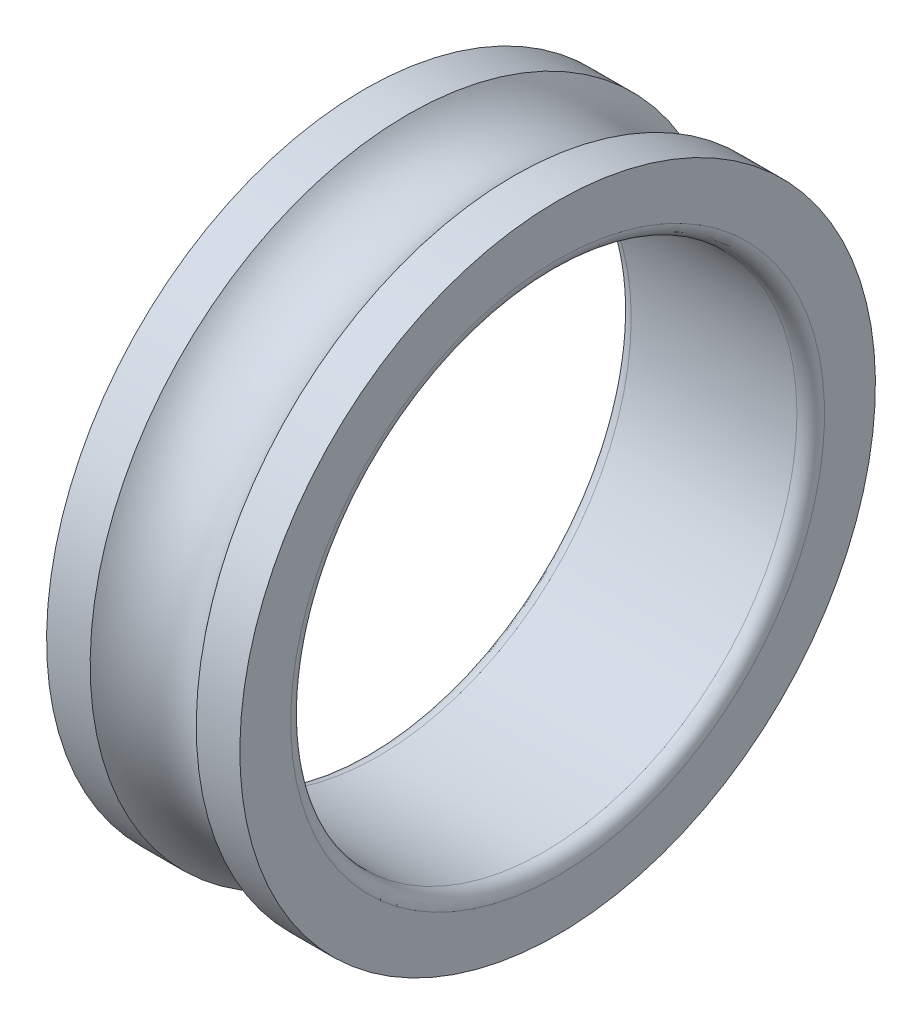
ISO-10303-21;
HEADER;
FILE_DESCRIPTION(('STEP AP214'),'2;1');
FILE_NAME('part.step','',(''),(''),'','','');
FILE_SCHEMA(('AUTOMOTIVE_DESIGN { 1 0 10303 214 1 1 1 1 }'));
ENDSEC;
DATA;
#1=APPLICATION_CONTEXT('core data for automotive mechanical design processes');
#2=APPLICATION_PROTOCOL_DEFINITION('international standard','automotive_design',2000,#1);
#3=PRODUCT_CONTEXT('',#1,'mechanical');
#4=PRODUCT('Part','Part','',(#3));
#5=PRODUCT_RELATED_PRODUCT_CATEGORY('part','',(#4));
#6=PRODUCT_DEFINITION_FORMATION('','',#4);
#7=PRODUCT_DEFINITION_CONTEXT('part definition',#1,'design');
#8=PRODUCT_DEFINITION('design','',#6,#7);
#9=PRODUCT_DEFINITION_SHAPE('','',#8);
#10=(LENGTH_UNIT() NAMED_UNIT(*) SI_UNIT(.MILLI.,.METRE.));
#11=(NAMED_UNIT(*) PLANE_ANGLE_UNIT() SI_UNIT($,.RADIAN.));
#12=(NAMED_UNIT(*) SI_UNIT($,.STERADIAN.) SOLID_ANGLE_UNIT());
#13=UNCERTAINTY_MEASURE_WITH_UNIT(LENGTH_MEASURE(1.E-05),#10,'distance_accuracy_value','');
#14=(GEOMETRIC_REPRESENTATION_CONTEXT(3) GLOBAL_UNCERTAINTY_ASSIGNED_CONTEXT((#13)) GLOBAL_UNIT_ASSIGNED_CONTEXT((#10,
#11,#12)) REPRESENTATION_CONTEXT('',''));
#15=CARTESIAN_POINT('',(0.,0.,0.));
#16=DIRECTION('',(0.,0.,1.));
#17=DIRECTION('',(1.,0.,0.));
#18=AXIS2_PLACEMENT_3D('',#15,#16,#17);
#19=CARTESIAN_POINT('',(18.6322012421065,0.,0.));
#20=DIRECTION('',(-1.,0.,0.));
#21=DIRECTION('',(0.,1.,0.));
#22=AXIS2_PLACEMENT_3D('',#19,#20,#21);
#23=CYLINDRICAL_SURFACE('',#22,34.53);
#24=CARTESIAN_POINT('',(16.2644024842129,0.,0.));
#25=DIRECTION('',(1.,0.,0.));
#26=DIRECTION('',(0.,1.,0.));
#27=AXIS2_PLACEMENT_3D('',#24,#25,#26);
#28=CIRCLE('',#27,34.53);
#29=CARTESIAN_POINT('',(16.2644024842129,34.53,0.));
#30=VERTEX_POINT('',#29);
#31=EDGE_CURVE('E11',#30,#30,#28,.T.);
#32=ORIENTED_EDGE('',*,*,#31,.T.);
#33=EDGE_LOOP('',(#32));
#34=FACE_BOUND('',#33,.T.);
#35=CARTESIAN_POINT('',(21.,0.,0.));
#36=DIRECTION('',(1.,0.,0.));
#37=DIRECTION('',(0.,1.,0.));
#38=AXIS2_PLACEMENT_3D('',#35,#36,#37);
#39=CIRCLE('',#38,34.53);
#40=CARTESIAN_POINT('',(21.,34.53,0.));
#41=VERTEX_POINT('',#40);
#42=EDGE_CURVE('E20',#41,#41,#39,.T.);
#43=ORIENTED_EDGE('',*,*,#42,.F.);
#44=EDGE_LOOP('',(#43));
#45=FACE_BOUND('',#44,.T.);
#46=ADVANCED_FACE('F16',(#34,#45),#23,.T.);
#47=CARTESIAN_POINT('',(10.5,0.,0.));
#48=DIRECTION('',(1.,0.,0.));
#49=DIRECTION('',(0.,0.,-1.));
#50=AXIS2_PLACEMENT_3D('',#47,#48,#49);
#51=TOROIDAL_SURFACE('',#50,38.75,7.144);
#52=CARTESIAN_POINT('',(4.73559751578708,0.,0.));
#53=DIRECTION('',(1.,0.,0.));
#54=DIRECTION('',(0.,1.,0.));
#55=AXIS2_PLACEMENT_3D('',#52,#53,#54);
#56=CIRCLE('',#55,34.53);
#57=CARTESIAN_POINT('',(4.73559751578708,34.53,0.));
#58=VERTEX_POINT('',#57);
#59=EDGE_CURVE('E26',#58,#58,#56,.T.);
#60=ORIENTED_EDGE('',*,*,#59,.T.);
#61=EDGE_LOOP('',(#60));
#62=FACE_BOUND('',#61,.T.);
#63=ORIENTED_EDGE('',*,*,#31,.F.);
#64=EDGE_LOOP('',(#63));
#65=FACE_BOUND('',#64,.T.);
#66=ADVANCED_FACE('F66',(#62,#65),#51,.F.);
#67=CARTESIAN_POINT('',(2.36779875789354,0.,0.));
#68=DIRECTION('',(-1.,0.,0.));
#69=DIRECTION('',(0.,1.,0.));
#70=AXIS2_PLACEMENT_3D('',#67,#68,#69);
#71=CYLINDRICAL_SURFACE('',#70,34.53);
#72=CARTESIAN_POINT('',(0.,0.,0.));
#73=DIRECTION('',(1.,0.,0.));
#74=DIRECTION('',(0.,1.,0.));
#75=AXIS2_PLACEMENT_3D('',#72,#73,#74);
#76=CIRCLE('',#75,34.53);
#77=CARTESIAN_POINT('',(0.,34.53,0.));
#78=VERTEX_POINT('',#77);
#79=EDGE_CURVE('E57',#78,#78,#76,.T.);
#80=ORIENTED_EDGE('',*,*,#79,.T.);
#81=EDGE_LOOP('',(#80));
#82=FACE_BOUND('',#81,.T.);
#83=ORIENTED_EDGE('',*,*,#59,.F.);
#84=EDGE_LOOP('',(#83));
#85=FACE_BOUND('',#84,.T.);
#86=ADVANCED_FACE('F69',(#82,#85),#71,.T.);
#87=CARTESIAN_POINT('',(0.,31.765,0.));
#88=DIRECTION('',(-1.,0.,0.));
#89=DIRECTION('',(0.,-1.,0.));
#90=AXIS2_PLACEMENT_3D('',#87,#88,#89);
#91=PLANE('',#90);
#92=CARTESIAN_POINT('',(0.,0.,0.));
#93=DIRECTION('',(1.,0.,0.));
#94=DIRECTION('',(0.,1.,0.));
#95=AXIS2_PLACEMENT_3D('',#92,#93,#94);
#96=CIRCLE('',#95,29.);
#97=CARTESIAN_POINT('',(0.,29.,0.));
#98=VERTEX_POINT('',#97);
#99=EDGE_CURVE('E55',#98,#98,#96,.T.);
#100=ORIENTED_EDGE('',*,*,#99,.T.);
#101=EDGE_LOOP('',(#100));
#102=FACE_BOUND('',#101,.T.);
#103=ORIENTED_EDGE('',*,*,#79,.F.);
#104=EDGE_LOOP('',(#103));
#105=FACE_BOUND('',#104,.T.);
#106=ADVANCED_FACE('F71',(#102,#105),#91,.T.);
#107=CARTESIAN_POINT('',(1.5,0.,0.));
#108=DIRECTION('',(1.,0.,0.));
#109=DIRECTION('',(0.,0.,-1.));
#110=AXIS2_PLACEMENT_3D('',#107,#108,#109);
#111=TOROIDAL_SURFACE('',#110,29.,1.5);
#112=CARTESIAN_POINT('',(1.5,0.,0.));
#113=DIRECTION('',(1.,0.,0.));
#114=DIRECTION('',(0.,1.,0.));
#115=AXIS2_PLACEMENT_3D('',#112,#113,#114);
#116=CIRCLE('',#115,27.5);
#117=CARTESIAN_POINT('',(1.5,27.5,0.));
#118=VERTEX_POINT('',#117);
#119=EDGE_CURVE('E51',#118,#118,#116,.T.);
#120=ORIENTED_EDGE('',*,*,#119,.T.);
#121=EDGE_LOOP('',(#120));
#122=FACE_BOUND('',#121,.T.);
#123=ORIENTED_EDGE('',*,*,#99,.F.);
#124=EDGE_LOOP('',(#123));
#125=FACE_BOUND('',#124,.T.);
#126=ADVANCED_FACE('F52',(#122,#125),#111,.T.);
#127=CARTESIAN_POINT('',(10.5,0.,0.));
#128=DIRECTION('',(-1.,0.,0.));
#129=DIRECTION('',(0.,1.,0.));
#130=AXIS2_PLACEMENT_3D('',#127,#128,#129);
#131=CYLINDRICAL_SURFACE('',#130,27.5);
#132=CARTESIAN_POINT('',(19.5,0.,0.));
#133=DIRECTION('',(1.,0.,0.));
#134=DIRECTION('',(0.,1.,0.));
#135=AXIS2_PLACEMENT_3D('',#132,#133,#134);
#136=CIRCLE('',#135,27.5);
#137=CARTESIAN_POINT('',(19.5,27.5,0.));
#138=VERTEX_POINT('',#137);
#139=EDGE_CURVE('E56',#138,#138,#136,.T.);
#140=ORIENTED_EDGE('',*,*,#139,.T.);
#141=EDGE_LOOP('',(#140));
#142=FACE_BOUND('',#141,.T.);
#143=ORIENTED_EDGE('',*,*,#119,.F.);
#144=EDGE_LOOP('',(#143));
#145=FACE_BOUND('',#144,.T.);
#146=ADVANCED_FACE('F88',(#142,#145),#131,.F.);
#147=CARTESIAN_POINT('',(19.5,0.,0.));
#148=DIRECTION('',(1.,0.,0.));
#149=DIRECTION('',(0.,0.,-1.));
#150=AXIS2_PLACEMENT_3D('',#147,#148,#149);
#151=TOROIDAL_SURFACE('',#150,29.,1.5);
#152=CARTESIAN_POINT('',(21.,0.,0.));
#153=DIRECTION('',(1.,0.,0.));
#154=DIRECTION('',(0.,1.,0.));
#155=AXIS2_PLACEMENT_3D('',#152,#153,#154);
#156=CIRCLE('',#155,29.);
#157=CARTESIAN_POINT('',(21.,29.,0.));
#158=VERTEX_POINT('',#157);
#159=EDGE_CURVE('E61',#158,#158,#156,.T.);
#160=ORIENTED_EDGE('',*,*,#159,.T.);
#161=EDGE_LOOP('',(#160));
#162=FACE_BOUND('',#161,.T.);
#163=ORIENTED_EDGE('',*,*,#139,.F.);
#164=EDGE_LOOP('',(#163));
#165=FACE_BOUND('',#164,.T.);
#166=ADVANCED_FACE('F18',(#162,#165),#151,.T.);
#167=CARTESIAN_POINT('',(21.,31.765,0.));
#168=DIRECTION('',(1.,0.,0.));
#169=DIRECTION('',(0.,1.,0.));
#170=AXIS2_PLACEMENT_3D('',#167,#168,#169);
#171=PLANE('',#170);
#172=ORIENTED_EDGE('',*,*,#42,.T.);
#173=EDGE_LOOP('',(#172));
#174=FACE_BOUND('',#173,.T.);
#175=ORIENTED_EDGE('',*,*,#159,.F.);
#176=EDGE_LOOP('',(#175));
#177=FACE_BOUND('',#176,.T.);
#178=ADVANCED_FACE('F93',(#174,#177),#171,.T.);
#179=CLOSED_SHELL('',(#46,#66,#86,#106,#126,#146,#166,#178));
#180=MANIFOLD_SOLID_BREP('B1',#179);
#181=ADVANCED_BREP_SHAPE_REPRESENTATION('',(#18,#180),#14);
#182=SHAPE_DEFINITION_REPRESENTATION(#9,#181);
ENDSEC;
END-ISO-10303-21;
